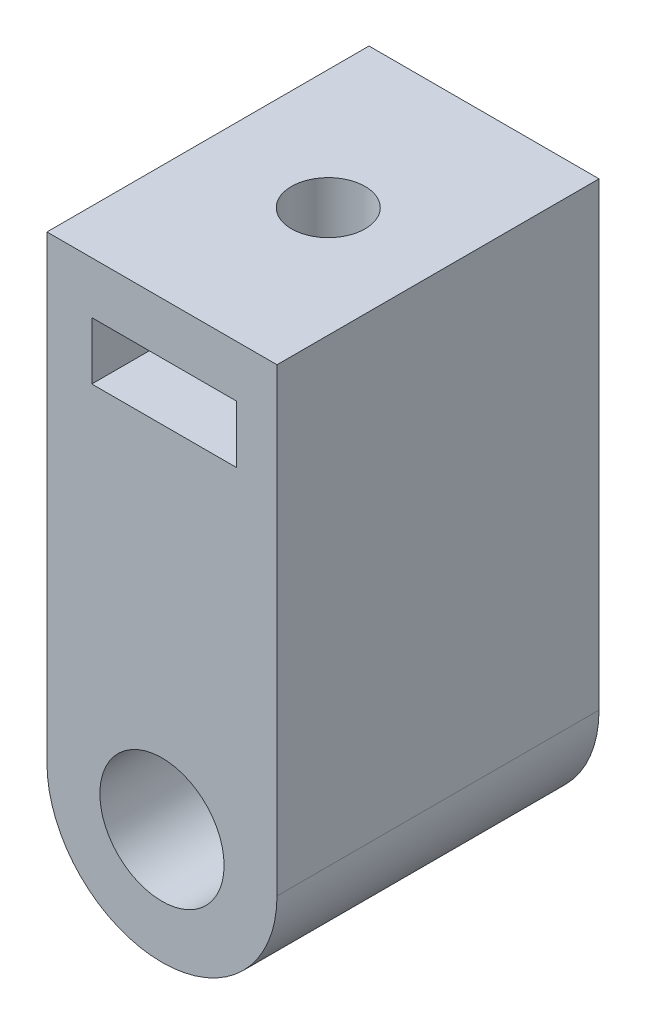
ISO-10303-21;
HEADER;
FILE_DESCRIPTION(('STEP AP214'),'2;1');
FILE_NAME('part.step','',(''),(''),'','','');
FILE_SCHEMA(('AUTOMOTIVE_DESIGN { 1 0 10303 214 1 1 1 1 }'));
ENDSEC;
DATA;
#1=APPLICATION_CONTEXT('core data for automotive mechanical design processes');
#2=APPLICATION_PROTOCOL_DEFINITION('international standard','automotive_design',2000,#1);
#3=PRODUCT_CONTEXT('',#1,'mechanical');
#4=PRODUCT('Part','Part','',(#3));
#5=PRODUCT_RELATED_PRODUCT_CATEGORY('part','',(#4));
#6=PRODUCT_DEFINITION_FORMATION('','',#4);
#7=PRODUCT_DEFINITION_CONTEXT('part definition',#1,'design');
#8=PRODUCT_DEFINITION('design','',#6,#7);
#9=PRODUCT_DEFINITION_SHAPE('','',#8);
#10=(LENGTH_UNIT() NAMED_UNIT(*) SI_UNIT(.MILLI.,.METRE.));
#11=(NAMED_UNIT(*) PLANE_ANGLE_UNIT() SI_UNIT($,.RADIAN.));
#12=(NAMED_UNIT(*) SI_UNIT($,.STERADIAN.) SOLID_ANGLE_UNIT());
#13=UNCERTAINTY_MEASURE_WITH_UNIT(LENGTH_MEASURE(1.E-05),#10,'distance_accuracy_value','');
#14=(GEOMETRIC_REPRESENTATION_CONTEXT(3) GLOBAL_UNCERTAINTY_ASSIGNED_CONTEXT((#13)) GLOBAL_UNIT_ASSIGNED_CONTEXT((#10,
#11,#12)) REPRESENTATION_CONTEXT('',''));
#15=CARTESIAN_POINT('',(0.,0.,0.));
#16=DIRECTION('',(0.,0.,1.));
#17=DIRECTION('',(1.,0.,0.));
#18=AXIS2_PLACEMENT_3D('',#15,#16,#17);
#19=CARTESIAN_POINT('',(0.,0.,14.));
#20=DIRECTION('',(0.,0.,1.));
#21=DIRECTION('',(1.,0.,0.));
#22=AXIS2_PLACEMENT_3D('',#19,#20,#21);
#23=PLANE('',#22);
#24=DIRECTION('',(0.,-1.,0.));
#25=VECTOR('',#24,1.);
#26=CARTESIAN_POINT('',(-3.05,17.75,14.));
#27=LINE('',#26,#25);
#28=CARTESIAN_POINT('',(-3.05,17.75,14.));
#29=VERTEX_POINT('',#28);
#30=CARTESIAN_POINT('',(-3.05,15.25,14.));
#31=VERTEX_POINT('',#30);
#32=EDGE_CURVE('E60',#29,#31,#27,.T.);
#33=ORIENTED_EDGE('',*,*,#32,.F.);
#34=DIRECTION('',(-1.,0.,0.));
#35=VECTOR('',#34,1.);
#36=CARTESIAN_POINT('',(3.25,17.75,14.));
#37=LINE('',#36,#35);
#38=CARTESIAN_POINT('',(3.25,17.75,14.));
#39=VERTEX_POINT('',#38);
#40=EDGE_CURVE('E171',#39,#29,#37,.T.);
#41=ORIENTED_EDGE('',*,*,#40,.F.);
#42=DIRECTION('',(0.,1.,0.));
#43=VECTOR('',#42,1.);
#44=CARTESIAN_POINT('',(3.25,17.75,14.));
#45=LINE('',#44,#43);
#46=CARTESIAN_POINT('',(3.25,15.25,14.));
#47=VERTEX_POINT('',#46);
#48=EDGE_CURVE('E185',#47,#39,#45,.T.);
#49=ORIENTED_EDGE('',*,*,#48,.F.);
#50=DIRECTION('',(1.,0.,0.));
#51=VECTOR('',#50,1.);
#52=CARTESIAN_POINT('',(3.25,15.25,14.));
#53=LINE('',#52,#51);
#54=EDGE_CURVE('E182',#31,#47,#53,.T.);
#55=ORIENTED_EDGE('',*,*,#54,.F.);
#56=EDGE_LOOP('',(#33,#41,#49,#55));
#57=FACE_BOUND('',#56,.T.);
#58=CARTESIAN_POINT('',(0.,0.,14.));
#59=DIRECTION('',(0.,0.,1.));
#60=DIRECTION('',(1.,0.,0.));
#61=AXIS2_PLACEMENT_3D('',#58,#59,#60);
#62=CIRCLE('',#61,5.);
#63=CARTESIAN_POINT('',(-5.,0.,14.));
#64=VERTEX_POINT('',#63);
#65=CARTESIAN_POINT('',(5.,0.,14.));
#66=VERTEX_POINT('',#65);
#67=EDGE_CURVE('E11',#64,#66,#62,.T.);
#68=ORIENTED_EDGE('',*,*,#67,.T.);
#69=DIRECTION('',(0.,1.,0.));
#70=VECTOR('',#69,1.);
#71=CARTESIAN_POINT('',(5.,0.,14.));
#72=LINE('',#71,#70);
#73=CARTESIAN_POINT('',(5.,20.,14.));
#74=VERTEX_POINT('',#73);
#75=EDGE_CURVE('E192',#66,#74,#72,.T.);
#76=ORIENTED_EDGE('',*,*,#75,.T.);
#77=DIRECTION('',(-1.,0.,0.));
#78=VECTOR('',#77,1.);
#79=CARTESIAN_POINT('',(-5.,20.,14.));
#80=LINE('',#79,#78);
#81=CARTESIAN_POINT('',(-5.,20.,14.));
#82=VERTEX_POINT('',#81);
#83=EDGE_CURVE('E207',#74,#82,#80,.T.);
#84=ORIENTED_EDGE('',*,*,#83,.T.);
#85=DIRECTION('',(0.,-1.,0.));
#86=VECTOR('',#85,1.);
#87=CARTESIAN_POINT('',(-5.,0.,14.));
#88=LINE('',#87,#86);
#89=EDGE_CURVE('E210',#82,#64,#88,.T.);
#90=ORIENTED_EDGE('',*,*,#89,.T.);
#91=EDGE_LOOP('',(#68,#76,#84,#90));
#92=FACE_BOUND('',#91,.T.);
#93=CARTESIAN_POINT('',(0.,0.,14.));
#94=DIRECTION('',(0.,0.,1.));
#95=DIRECTION('',(1.,0.,0.));
#96=AXIS2_PLACEMENT_3D('',#93,#94,#95);
#97=CIRCLE('',#96,2.7);
#98=CARTESIAN_POINT('',(2.7,0.,14.));
#99=VERTEX_POINT('',#98);
#100=EDGE_CURVE('E223',#99,#99,#97,.T.);
#101=ORIENTED_EDGE('',*,*,#100,.F.);
#102=EDGE_LOOP('',(#101));
#103=FACE_BOUND('',#102,.T.);
#104=ADVANCED_FACE('F35',(#57,#92,#103),#23,.T.);
#105=CARTESIAN_POINT('',(0.,0.,0.));
#106=DIRECTION('',(0.,0.,1.));
#107=DIRECTION('',(1.,0.,0.));
#108=AXIS2_PLACEMENT_3D('',#105,#106,#107);
#109=PLANE('',#108);
#110=DIRECTION('',(0.,-1.,0.));
#111=VECTOR('',#110,1.);
#112=CARTESIAN_POINT('',(5.,0.,0.));
#113=LINE('',#112,#111);
#114=CARTESIAN_POINT('',(5.,20.,0.));
#115=VERTEX_POINT('',#114);
#116=CARTESIAN_POINT('',(5.,0.,0.));
#117=VERTEX_POINT('',#116);
#118=EDGE_CURVE('E200',#115,#117,#113,.T.);
#119=ORIENTED_EDGE('',*,*,#118,.T.);
#120=CARTESIAN_POINT('',(0.,0.,0.));
#121=DIRECTION('',(0.,0.,1.));
#122=DIRECTION('',(1.,0.,0.));
#123=AXIS2_PLACEMENT_3D('',#120,#121,#122);
#124=CIRCLE('',#123,5.);
#125=CARTESIAN_POINT('',(-5.,0.,0.));
#126=VERTEX_POINT('',#125);
#127=EDGE_CURVE('E44',#126,#117,#124,.T.);
#128=ORIENTED_EDGE('',*,*,#127,.F.);
#129=DIRECTION('',(0.,1.,0.));
#130=VECTOR('',#129,1.);
#131=CARTESIAN_POINT('',(-5.,0.,0.));
#132=LINE('',#131,#130);
#133=CARTESIAN_POINT('',(-5.,20.,0.));
#134=VERTEX_POINT('',#133);
#135=EDGE_CURVE('E198',#126,#134,#132,.T.);
#136=ORIENTED_EDGE('',*,*,#135,.T.);
#137=DIRECTION('',(1.,0.,0.));
#138=VECTOR('',#137,1.);
#139=CARTESIAN_POINT('',(-5.,20.,0.));
#140=LINE('',#139,#138);
#141=EDGE_CURVE('E204',#134,#115,#140,.T.);
#142=ORIENTED_EDGE('',*,*,#141,.T.);
#143=EDGE_LOOP('',(#119,#128,#136,#142));
#144=FACE_BOUND('',#143,.T.);
#145=CARTESIAN_POINT('',(0.,0.,0.));
#146=DIRECTION('',(0.,0.,1.));
#147=DIRECTION('',(1.,0.,0.));
#148=AXIS2_PLACEMENT_3D('',#145,#146,#147);
#149=CIRCLE('',#148,2.7);
#150=CARTESIAN_POINT('',(2.7,0.,0.));
#151=VERTEX_POINT('',#150);
#152=EDGE_CURVE('E222',#151,#151,#149,.T.);
#153=ORIENTED_EDGE('',*,*,#152,.T.);
#154=EDGE_LOOP('',(#153));
#155=FACE_BOUND('',#154,.T.);
#156=ADVANCED_FACE('F233',(#144,#155),#109,.F.);
#157=CARTESIAN_POINT('',(0.,0.,14.));
#158=DIRECTION('',(0.,0.,-1.));
#159=DIRECTION('',(-1.,0.,0.));
#160=AXIS2_PLACEMENT_3D('',#157,#158,#159);
#161=CYLINDRICAL_SURFACE('',#160,5.);
#162=ORIENTED_EDGE('',*,*,#127,.T.);
#163=DIRECTION('',(0.,0.,1.));
#164=VECTOR('',#163,1.);
#165=CARTESIAN_POINT('',(5.,0.,-22.3606797749979));
#166=LINE('',#165,#164);
#167=EDGE_CURVE('E201',#117,#66,#166,.T.);
#168=ORIENTED_EDGE('',*,*,#167,.T.);
#169=ORIENTED_EDGE('',*,*,#67,.F.);
#170=DIRECTION('',(0.,0.,1.));
#171=VECTOR('',#170,1.);
#172=CARTESIAN_POINT('',(-5.,0.,-22.3606797749979));
#173=LINE('',#172,#171);
#174=EDGE_CURVE('E215',#126,#64,#173,.T.);
#175=ORIENTED_EDGE('',*,*,#174,.F.);
#176=EDGE_LOOP('',(#162,#168,#169,#175));
#177=FACE_BOUND('',#176,.T.);
#178=ADVANCED_FACE('F37',(#177),#161,.T.);
#179=CARTESIAN_POINT('',(0.,0.,14.));
#180=DIRECTION('',(0.,0.,-1.));
#181=DIRECTION('',(-1.,0.,0.));
#182=AXIS2_PLACEMENT_3D('',#179,#180,#181);
#183=CYLINDRICAL_SURFACE('',#182,2.7);
#184=ORIENTED_EDGE('',*,*,#100,.T.);
#185=EDGE_LOOP('',(#184));
#186=FACE_BOUND('',#185,.T.);
#187=ORIENTED_EDGE('',*,*,#152,.F.);
#188=EDGE_LOOP('',(#187));
#189=FACE_BOUND('',#188,.T.);
#190=ADVANCED_FACE('F270',(#186,#189),#183,.F.);
#191=CARTESIAN_POINT('',(5.,0.,-22.3606797749979));
#192=DIRECTION('',(1.,0.,0.));
#193=DIRECTION('',(0.,1.,0.));
#194=AXIS2_PLACEMENT_3D('',#191,#192,#193);
#195=PLANE('',#194);
#196=ORIENTED_EDGE('',*,*,#118,.F.);
#197=DIRECTION('',(0.,0.,1.));
#198=VECTOR('',#197,1.);
#199=CARTESIAN_POINT('',(5.,20.,-22.3606797749979));
#200=LINE('',#199,#198);
#201=EDGE_CURVE('E213',#115,#74,#200,.T.);
#202=ORIENTED_EDGE('',*,*,#201,.T.);
#203=ORIENTED_EDGE('',*,*,#75,.F.);
#204=ORIENTED_EDGE('',*,*,#167,.F.);
#205=EDGE_LOOP('',(#196,#202,#203,#204));
#206=FACE_BOUND('',#205,.T.);
#207=ADVANCED_FACE('F239',(#206),#195,.T.);
#208=CARTESIAN_POINT('',(-5.,0.,-22.3606797749979));
#209=DIRECTION('',(-1.,0.,0.));
#210=DIRECTION('',(0.,0.,1.));
#211=AXIS2_PLACEMENT_3D('',#208,#209,#210);
#212=PLANE('',#211);
#213=DIRECTION('',(0.,1.,0.));
#214=VECTOR('',#213,1.);
#215=CARTESIAN_POINT('',(-5.,2.925,12.5));
#216=LINE('',#215,#214);
#217=CARTESIAN_POINT('',(-5.,2.925,12.5));
#218=VERTEX_POINT('',#217);
#219=CARTESIAN_POINT('',(-5.,12.975,12.5));
#220=VERTEX_POINT('',#219);
#221=EDGE_CURVE('E52',#218,#220,#216,.T.);
#222=ORIENTED_EDGE('',*,*,#221,.F.);
#223=DIRECTION('',(0.,0.,1.));
#224=VECTOR('',#223,1.);
#225=CARTESIAN_POINT('',(-5.,2.925,1.44173298));
#226=LINE('',#225,#224);
#227=CARTESIAN_POINT('',(-5.,2.925,1.44173298));
#228=VERTEX_POINT('',#227);
#229=EDGE_CURVE('E146',#228,#218,#226,.T.);
#230=ORIENTED_EDGE('',*,*,#229,.F.);
#231=DIRECTION('',(0.,-1.,0.));
#232=VECTOR('',#231,1.);
#233=CARTESIAN_POINT('',(-5.,2.925,1.44173298));
#234=LINE('',#233,#232);
#235=CARTESIAN_POINT('',(-5.,12.975,1.44173298));
#236=VERTEX_POINT('',#235);
#237=EDGE_CURVE('E149',#236,#228,#234,.T.);
#238=ORIENTED_EDGE('',*,*,#237,.F.);
#239=DIRECTION('',(0.,0.,-1.));
#240=VECTOR('',#239,1.);
#241=CARTESIAN_POINT('',(-5.,12.975,1.44173298));
#242=LINE('',#241,#240);
#243=EDGE_CURVE('E158',#220,#236,#242,.T.);
#244=ORIENTED_EDGE('',*,*,#243,.F.);
#245=EDGE_LOOP('',(#222,#230,#238,#244));
#246=FACE_BOUND('',#245,.T.);
#247=ORIENTED_EDGE('',*,*,#135,.F.);
#248=ORIENTED_EDGE('',*,*,#174,.T.);
#249=ORIENTED_EDGE('',*,*,#89,.F.);
#250=DIRECTION('',(0.,0.,1.));
#251=VECTOR('',#250,1.);
#252=CARTESIAN_POINT('',(-5.,20.,-22.3606797749979));
#253=LINE('',#252,#251);
#254=EDGE_CURVE('E218',#134,#82,#253,.T.);
#255=ORIENTED_EDGE('',*,*,#254,.F.);
#256=EDGE_LOOP('',(#247,#248,#249,#255));
#257=FACE_BOUND('',#256,.T.);
#258=ADVANCED_FACE('F245',(#246,#257),#212,.T.);
#259=CARTESIAN_POINT('',(-5.,20.,-22.3606797749979));
#260=DIRECTION('',(0.,1.,0.));
#261=DIRECTION('',(0.,0.,1.));
#262=AXIS2_PLACEMENT_3D('',#259,#260,#261);
#263=PLANE('',#262);
#264=CARTESIAN_POINT('',(0.19946897,20.,6.97086649));
#265=DIRECTION('',(0.,1.,0.));
#266=DIRECTION('',(0.,0.,1.));
#267=AXIS2_PLACEMENT_3D('',#264,#265,#266);
#268=CIRCLE('',#267,1.6);
#269=CARTESIAN_POINT('',(0.19946897,20.,8.57086649));
#270=VERTEX_POINT('',#269);
#271=EDGE_CURVE('E471',#270,#270,#268,.T.);
#272=ORIENTED_EDGE('',*,*,#271,.F.);
#273=EDGE_LOOP('',(#272));
#274=FACE_BOUND('',#273,.T.);
#275=ORIENTED_EDGE('',*,*,#141,.F.);
#276=ORIENTED_EDGE('',*,*,#254,.T.);
#277=ORIENTED_EDGE('',*,*,#83,.F.);
#278=ORIENTED_EDGE('',*,*,#201,.F.);
#279=EDGE_LOOP('',(#275,#276,#277,#278));
#280=FACE_BOUND('',#279,.T.);
#281=ADVANCED_FACE('F248',(#274,#280),#263,.T.);
#282=CARTESIAN_POINT('',(-3.05,17.75,4.));
#283=DIRECTION('',(-1.,0.,0.));
#284=DIRECTION('',(0.,-1.,0.));
#285=AXIS2_PLACEMENT_3D('',#282,#283,#284);
#286=PLANE('',#285);
#287=ORIENTED_EDGE('',*,*,#32,.T.);
#288=DIRECTION('',(0.,0.,1.));
#289=VECTOR('',#288,1.);
#290=CARTESIAN_POINT('',(-3.05,15.25,4.));
#291=LINE('',#290,#289);
#292=CARTESIAN_POINT('',(-3.05,15.25,4.));
#293=VERTEX_POINT('',#292);
#294=EDGE_CURVE('E180',#293,#31,#291,.T.);
#295=ORIENTED_EDGE('',*,*,#294,.F.);
#296=DIRECTION('',(0.,-1.,0.));
#297=VECTOR('',#296,1.);
#298=CARTESIAN_POINT('',(-3.05,17.75,4.));
#299=LINE('',#298,#297);
#300=CARTESIAN_POINT('',(-3.05,17.75,4.));
#301=VERTEX_POINT('',#300);
#302=EDGE_CURVE('E167',#301,#293,#299,.T.);
#303=ORIENTED_EDGE('',*,*,#302,.F.);
#304=DIRECTION('',(0.,0.,1.));
#305=VECTOR('',#304,1.);
#306=CARTESIAN_POINT('',(-3.05,17.75,4.));
#307=LINE('',#306,#305);
#308=EDGE_CURVE('E190',#301,#29,#307,.T.);
#309=ORIENTED_EDGE('',*,*,#308,.T.);
#310=EDGE_LOOP('',(#287,#295,#303,#309));
#311=FACE_BOUND('',#310,.T.);
#312=ADVANCED_FACE('F250',(#311),#286,.F.);
#313=CARTESIAN_POINT('',(3.25,17.75,4.));
#314=DIRECTION('',(0.,1.,0.));
#315=DIRECTION('',(0.,0.,1.));
#316=AXIS2_PLACEMENT_3D('',#313,#314,#315);
#317=PLANE('',#316);
#318=CARTESIAN_POINT('',(0.19946897,17.75,6.97086649));
#319=DIRECTION('',(0.,1.,0.));
#320=DIRECTION('',(0.,0.,1.));
#321=AXIS2_PLACEMENT_3D('',#318,#319,#320);
#322=CIRCLE('',#321,1.6);
#323=CARTESIAN_POINT('',(0.19946897,17.75,8.57086649));
#324=VERTEX_POINT('',#323);
#325=EDGE_CURVE('E152',#324,#324,#322,.F.);
#326=ORIENTED_EDGE('',*,*,#325,.F.);
#327=EDGE_LOOP('',(#326));
#328=FACE_BOUND('',#327,.T.);
#329=ORIENTED_EDGE('',*,*,#40,.T.);
#330=ORIENTED_EDGE('',*,*,#308,.F.);
#331=DIRECTION('',(-1.,0.,0.));
#332=VECTOR('',#331,1.);
#333=CARTESIAN_POINT('',(3.25,17.75,4.));
#334=LINE('',#333,#332);
#335=CARTESIAN_POINT('',(3.25,17.75,4.));
#336=VERTEX_POINT('',#335);
#337=EDGE_CURVE('E177',#336,#301,#334,.T.);
#338=ORIENTED_EDGE('',*,*,#337,.F.);
#339=DIRECTION('',(0.,0.,1.));
#340=VECTOR('',#339,1.);
#341=CARTESIAN_POINT('',(3.25,17.75,4.));
#342=LINE('',#341,#340);
#343=EDGE_CURVE('E193',#336,#39,#342,.T.);
#344=ORIENTED_EDGE('',*,*,#343,.T.);
#345=EDGE_LOOP('',(#329,#330,#338,#344));
#346=FACE_BOUND('',#345,.T.);
#347=ADVANCED_FACE('F257',(#328,#346),#317,.F.);
#348=CARTESIAN_POINT('',(3.25,17.75,4.));
#349=DIRECTION('',(1.,0.,0.));
#350=DIRECTION('',(0.,0.,-1.));
#351=AXIS2_PLACEMENT_3D('',#348,#349,#350);
#352=PLANE('',#351);
#353=ORIENTED_EDGE('',*,*,#48,.T.);
#354=ORIENTED_EDGE('',*,*,#343,.F.);
#355=DIRECTION('',(0.,1.,0.));
#356=VECTOR('',#355,1.);
#357=CARTESIAN_POINT('',(3.25,17.75,4.));
#358=LINE('',#357,#356);
#359=CARTESIAN_POINT('',(3.25,15.25,4.));
#360=VERTEX_POINT('',#359);
#361=EDGE_CURVE('E174',#360,#336,#358,.T.);
#362=ORIENTED_EDGE('',*,*,#361,.F.);
#363=DIRECTION('',(0.,0.,1.));
#364=VECTOR('',#363,1.);
#365=CARTESIAN_POINT('',(3.25,15.25,4.));
#366=LINE('',#365,#364);
#367=EDGE_CURVE('E195',#360,#47,#366,.T.);
#368=ORIENTED_EDGE('',*,*,#367,.T.);
#369=EDGE_LOOP('',(#353,#354,#362,#368));
#370=FACE_BOUND('',#369,.T.);
#371=ADVANCED_FACE('F381',(#370),#352,.F.);
#372=CARTESIAN_POINT('',(3.25,15.25,4.));
#373=DIRECTION('',(0.,-1.,0.));
#374=DIRECTION('',(0.,0.,-1.));
#375=AXIS2_PLACEMENT_3D('',#372,#373,#374);
#376=PLANE('',#375);
#377=CARTESIAN_POINT('',(0.19946897,15.25,6.97086649));
#378=DIRECTION('',(0.,-1.,0.));
#379=DIRECTION('',(0.,0.,-1.));
#380=AXIS2_PLACEMENT_3D('',#377,#378,#379);
#381=CIRCLE('',#380,1.6);
#382=CARTESIAN_POINT('',(0.19946897,15.25,5.37086649));
#383=VERTEX_POINT('',#382);
#384=EDGE_CURVE('E466',#383,#383,#381,.F.);
#385=ORIENTED_EDGE('',*,*,#384,.F.);
#386=EDGE_LOOP('',(#385));
#387=FACE_BOUND('',#386,.T.);
#388=ORIENTED_EDGE('',*,*,#54,.T.);
#389=ORIENTED_EDGE('',*,*,#367,.F.);
#390=DIRECTION('',(1.,0.,0.));
#391=VECTOR('',#390,1.);
#392=CARTESIAN_POINT('',(3.25,15.25,4.));
#393=LINE('',#392,#391);
#394=EDGE_CURVE('E170',#293,#360,#393,.T.);
#395=ORIENTED_EDGE('',*,*,#394,.F.);
#396=ORIENTED_EDGE('',*,*,#294,.T.);
#397=EDGE_LOOP('',(#388,#389,#395,#396));
#398=FACE_BOUND('',#397,.T.);
#399=ADVANCED_FACE('F372',(#387,#398),#376,.F.);
#400=CARTESIAN_POINT('',(0.,0.,4.));
#401=DIRECTION('',(0.,0.,-1.));
#402=DIRECTION('',(-1.,0.,0.));
#403=AXIS2_PLACEMENT_3D('',#400,#401,#402);
#404=PLANE('',#403);
#405=ORIENTED_EDGE('',*,*,#302,.T.);
#406=ORIENTED_EDGE('',*,*,#394,.T.);
#407=ORIENTED_EDGE('',*,*,#361,.T.);
#408=ORIENTED_EDGE('',*,*,#337,.T.);
#409=EDGE_LOOP('',(#405,#406,#407,#408));
#410=FACE_BOUND('',#409,.T.);
#411=ADVANCED_FACE('F365',(#410),#404,.F.);
#412=CARTESIAN_POINT('',(4.4,2.925,12.5));
#413=DIRECTION('',(0.,0.,1.));
#414=DIRECTION('',(1.,0.,0.));
#415=AXIS2_PLACEMENT_3D('',#412,#413,#414);
#416=PLANE('',#415);
#417=ORIENTED_EDGE('',*,*,#221,.T.);
#418=DIRECTION('',(-1.,0.,0.));
#419=VECTOR('',#418,1.);
#420=CARTESIAN_POINT('',(4.4,12.975,12.5));
#421=LINE('',#420,#419);
#422=CARTESIAN_POINT('',(4.4,12.975,12.5));
#423=VERTEX_POINT('',#422);
#424=EDGE_CURVE('E124',#423,#220,#421,.T.);
#425=ORIENTED_EDGE('',*,*,#424,.F.);
#426=DIRECTION('',(0.,1.,0.));
#427=VECTOR('',#426,1.);
#428=CARTESIAN_POINT('',(4.4,2.925,12.5));
#429=LINE('',#428,#427);
#430=CARTESIAN_POINT('',(4.4,2.925,12.5));
#431=VERTEX_POINT('',#430);
#432=EDGE_CURVE('E128',#431,#423,#429,.T.);
#433=ORIENTED_EDGE('',*,*,#432,.F.);
#434=DIRECTION('',(-1.,0.,0.));
#435=VECTOR('',#434,1.);
#436=CARTESIAN_POINT('',(4.4,2.925,12.5));
#437=LINE('',#436,#435);
#438=EDGE_CURVE('E162',#431,#218,#437,.T.);
#439=ORIENTED_EDGE('',*,*,#438,.T.);
#440=EDGE_LOOP('',(#417,#425,#433,#439));
#441=FACE_BOUND('',#440,.T.);
#442=ADVANCED_FACE('F126',(#441),#416,.F.);
#443=CARTESIAN_POINT('',(4.4,2.925,1.44173298));
#444=DIRECTION('',(0.,-1.,0.));
#445=DIRECTION('',(0.,0.,-1.));
#446=AXIS2_PLACEMENT_3D('',#443,#444,#445);
#447=PLANE('',#446);
#448=ORIENTED_EDGE('',*,*,#229,.T.);
#449=ORIENTED_EDGE('',*,*,#438,.F.);
#450=DIRECTION('',(0.,0.,1.));
#451=VECTOR('',#450,1.);
#452=CARTESIAN_POINT('',(4.4,2.925,1.44173298));
#453=LINE('',#452,#451);
#454=CARTESIAN_POINT('',(4.4,2.925,1.44173298));
#455=VERTEX_POINT('',#454);
#456=EDGE_CURVE('E134',#455,#431,#453,.T.);
#457=ORIENTED_EDGE('',*,*,#456,.F.);
#458=DIRECTION('',(-1.,0.,0.));
#459=VECTOR('',#458,1.);
#460=CARTESIAN_POINT('',(4.4,2.925,1.44173298));
#461=LINE('',#460,#459);
#462=EDGE_CURVE('E164',#455,#228,#461,.T.);
#463=ORIENTED_EDGE('',*,*,#462,.T.);
#464=EDGE_LOOP('',(#448,#449,#457,#463));
#465=FACE_BOUND('',#464,.T.);
#466=ADVANCED_FACE('F295',(#465),#447,.F.);
#467=CARTESIAN_POINT('',(4.4,2.925,1.44173298));
#468=DIRECTION('',(0.,0.,-1.));
#469=DIRECTION('',(-1.,0.,0.));
#470=AXIS2_PLACEMENT_3D('',#467,#468,#469);
#471=PLANE('',#470);
#472=ORIENTED_EDGE('',*,*,#237,.T.);
#473=ORIENTED_EDGE('',*,*,#462,.F.);
#474=DIRECTION('',(0.,-1.,0.));
#475=VECTOR('',#474,1.);
#476=CARTESIAN_POINT('',(4.4,2.925,1.44173298));
#477=LINE('',#476,#475);
#478=CARTESIAN_POINT('',(4.4,12.975,1.44173298));
#479=VERTEX_POINT('',#478);
#480=EDGE_CURVE('E142',#479,#455,#477,.T.);
#481=ORIENTED_EDGE('',*,*,#480,.F.);
#482=DIRECTION('',(-1.,0.,0.));
#483=VECTOR('',#482,1.);
#484=CARTESIAN_POINT('',(4.4,12.975,1.44173298));
#485=LINE('',#484,#483);
#486=EDGE_CURVE('E133',#479,#236,#485,.T.);
#487=ORIENTED_EDGE('',*,*,#486,.T.);
#488=EDGE_LOOP('',(#472,#473,#481,#487));
#489=FACE_BOUND('',#488,.T.);
#490=ADVANCED_FACE('F299',(#489),#471,.F.);
#491=CARTESIAN_POINT('',(4.4,12.975,1.44173298));
#492=DIRECTION('',(0.,1.,0.));
#493=DIRECTION('',(0.,0.,1.));
#494=AXIS2_PLACEMENT_3D('',#491,#492,#493);
#495=PLANE('',#494);
#496=CARTESIAN_POINT('',(0.19946897,12.975,6.97086649));
#497=DIRECTION('',(0.,1.,0.));
#498=DIRECTION('',(0.,0.,1.));
#499=AXIS2_PLACEMENT_3D('',#496,#497,#498);
#500=CIRCLE('',#499,1.6);
#501=CARTESIAN_POINT('',(0.19946897,12.975,8.57086649));
#502=VERTEX_POINT('',#501);
#503=EDGE_CURVE('E39',#502,#502,#500,.F.);
#504=ORIENTED_EDGE('',*,*,#503,.F.);
#505=EDGE_LOOP('',(#504));
#506=FACE_BOUND('',#505,.T.);
#507=ORIENTED_EDGE('',*,*,#243,.T.);
#508=ORIENTED_EDGE('',*,*,#486,.F.);
#509=DIRECTION('',(0.,0.,-1.));
#510=VECTOR('',#509,1.);
#511=CARTESIAN_POINT('',(4.4,12.975,1.44173298));
#512=LINE('',#511,#510);
#513=EDGE_CURVE('E137',#423,#479,#512,.T.);
#514=ORIENTED_EDGE('',*,*,#513,.F.);
#515=ORIENTED_EDGE('',*,*,#424,.T.);
#516=EDGE_LOOP('',(#507,#508,#514,#515));
#517=FACE_BOUND('',#516,.T.);
#518=ADVANCED_FACE('F138',(#506,#517),#495,.F.);
#519=CARTESIAN_POINT('',(4.4,0.,0.));
#520=DIRECTION('',(1.,0.,0.));
#521=DIRECTION('',(0.,0.,-1.));
#522=AXIS2_PLACEMENT_3D('',#519,#520,#521);
#523=PLANE('',#522);
#524=ORIENTED_EDGE('',*,*,#432,.T.);
#525=ORIENTED_EDGE('',*,*,#513,.T.);
#526=ORIENTED_EDGE('',*,*,#480,.T.);
#527=ORIENTED_EDGE('',*,*,#456,.T.);
#528=EDGE_LOOP('',(#524,#525,#526,#527));
#529=FACE_BOUND('',#528,.T.);
#530=ADVANCED_FACE('F144',(#529),#523,.F.);
#531=CARTESIAN_POINT('',(0.19946897,20.,6.97086649));
#532=DIRECTION('',(0.,-1.,0.));
#533=DIRECTION('',(0.,0.,-1.));
#534=AXIS2_PLACEMENT_3D('',#531,#532,#533);
#535=CYLINDRICAL_SURFACE('',#534,1.6);
#536=ORIENTED_EDGE('',*,*,#503,.T.);
#537=EDGE_LOOP('',(#536));
#538=FACE_BOUND('',#537,.T.);
#539=ORIENTED_EDGE('',*,*,#384,.T.);
#540=EDGE_LOOP('',(#539));
#541=FACE_BOUND('',#540,.T.);
#542=ADVANCED_FACE('F329',(#538,#541),#535,.F.);
#543=ORIENTED_EDGE('',*,*,#271,.T.);
#544=EDGE_LOOP('',(#543));
#545=FACE_BOUND('',#544,.T.);
#546=ORIENTED_EDGE('',*,*,#325,.T.);
#547=EDGE_LOOP('',(#546));
#548=FACE_BOUND('',#547,.T.);
#549=ADVANCED_FACE('F335',(#545,#548),#535,.F.);
#550=CLOSED_SHELL('',(#104,#156,#178,#190,#207,#258,#281,#312,#347,#371,#399,#411,#442,#466,
#490,#518,#530,#542,#549));
#551=MANIFOLD_SOLID_BREP('B2',#550);
#552=ADVANCED_BREP_SHAPE_REPRESENTATION('',(#18,#551),#14);
#553=SHAPE_DEFINITION_REPRESENTATION(#9,#552);
ENDSEC;
END-ISO-10303-21;
